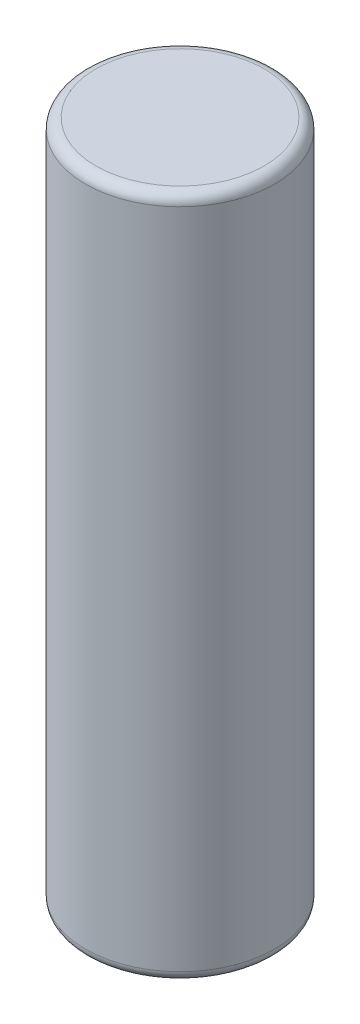
ISO-10303-21;
HEADER;
FILE_DESCRIPTION(('STEP AP214'),'2;1');
FILE_NAME('part.step','',(''),(''),'','','');
FILE_SCHEMA(('AUTOMOTIVE_DESIGN { 1 0 10303 214 1 1 1 1 }'));
ENDSEC;
DATA;
#1=APPLICATION_CONTEXT('core data for automotive mechanical design processes');
#2=APPLICATION_PROTOCOL_DEFINITION('international standard','automotive_design',2000,#1);
#3=PRODUCT_CONTEXT('',#1,'mechanical');
#4=PRODUCT('Part','Part','',(#3));
#5=PRODUCT_RELATED_PRODUCT_CATEGORY('part','',(#4));
#6=PRODUCT_DEFINITION_FORMATION('','',#4);
#7=PRODUCT_DEFINITION_CONTEXT('part definition',#1,'design');
#8=PRODUCT_DEFINITION('design','',#6,#7);
#9=PRODUCT_DEFINITION_SHAPE('','',#8);
#10=(LENGTH_UNIT() NAMED_UNIT(*) SI_UNIT(.MILLI.,.METRE.));
#11=(NAMED_UNIT(*) PLANE_ANGLE_UNIT() SI_UNIT($,.RADIAN.));
#12=(NAMED_UNIT(*) SI_UNIT($,.STERADIAN.) SOLID_ANGLE_UNIT());
#13=UNCERTAINTY_MEASURE_WITH_UNIT(LENGTH_MEASURE(1.E-05),#10,'distance_accuracy_value','');
#14=(GEOMETRIC_REPRESENTATION_CONTEXT(3) GLOBAL_UNCERTAINTY_ASSIGNED_CONTEXT((#13)) GLOBAL_UNIT_ASSIGNED_CONTEXT((#10,
#11,#12)) REPRESENTATION_CONTEXT('',''));
#15=CARTESIAN_POINT('',(0.,0.,0.));
#16=DIRECTION('',(0.,0.,1.));
#17=DIRECTION('',(1.,0.,0.));
#18=AXIS2_PLACEMENT_3D('',#15,#16,#17);
#19=CARTESIAN_POINT('',(0.,65.,0.));
#20=DIRECTION('',(0.,-1.,0.));
#21=DIRECTION('',(0.,0.,-1.));
#22=AXIS2_PLACEMENT_3D('',#19,#20,#21);
#23=CYLINDRICAL_SURFACE('',#22,9.);
#24=CARTESIAN_POINT('',(0.,1.,0.));
#25=DIRECTION('',(0.,1.,0.));
#26=DIRECTION('',(0.,0.,1.));
#27=AXIS2_PLACEMENT_3D('',#24,#25,#26);
#28=CIRCLE('',#27,9.);
#29=CARTESIAN_POINT('',(0.,1.,9.));
#30=VERTEX_POINT('',#29);
#31=EDGE_CURVE('E43',#30,#30,#28,.T.);
#32=ORIENTED_EDGE('',*,*,#31,.T.);
#33=EDGE_LOOP('',(#32));
#34=FACE_BOUND('',#33,.T.);
#35=CARTESIAN_POINT('',(0.,64.,0.));
#36=DIRECTION('',(0.,1.,0.));
#37=DIRECTION('',(0.,0.,1.));
#38=AXIS2_PLACEMENT_3D('',#35,#36,#37);
#39=CIRCLE('',#38,9.);
#40=CARTESIAN_POINT('',(0.,64.,9.));
#41=VERTEX_POINT('',#40);
#42=EDGE_CURVE('E47',#41,#41,#39,.F.);
#43=ORIENTED_EDGE('',*,*,#42,.T.);
#44=EDGE_LOOP('',(#43));
#45=FACE_BOUND('',#44,.T.);
#46=ADVANCED_FACE('F32',(#34,#45),#23,.T.);
#47=CARTESIAN_POINT('',(0.,65.,0.));
#48=DIRECTION('',(0.,1.,0.));
#49=DIRECTION('',(0.,0.,1.));
#50=AXIS2_PLACEMENT_3D('',#47,#48,#49);
#51=PLANE('',#50);
#52=CARTESIAN_POINT('',(0.,65.,0.));
#53=DIRECTION('',(0.,1.,0.));
#54=DIRECTION('',(0.,0.,1.));
#55=AXIS2_PLACEMENT_3D('',#52,#53,#54);
#56=CIRCLE('',#55,8.);
#57=CARTESIAN_POINT('',(0.,65.,8.));
#58=VERTEX_POINT('',#57);
#59=EDGE_CURVE('E10',#58,#58,#56,.T.);
#60=ORIENTED_EDGE('',*,*,#59,.T.);
#61=EDGE_LOOP('',(#60));
#62=FACE_BOUND('',#61,.T.);
#63=ADVANCED_FACE('F63',(#62),#51,.T.);
#64=CARTESIAN_POINT('',(0.,0.,0.));
#65=DIRECTION('',(0.,1.,0.));
#66=DIRECTION('',(0.,0.,1.));
#67=AXIS2_PLACEMENT_3D('',#64,#65,#66);
#68=PLANE('',#67);
#69=CARTESIAN_POINT('',(0.,0.,0.));
#70=DIRECTION('',(0.,1.,0.));
#71=DIRECTION('',(0.,0.,1.));
#72=AXIS2_PLACEMENT_3D('',#69,#70,#71);
#73=CIRCLE('',#72,8.);
#74=CARTESIAN_POINT('',(0.,0.,8.));
#75=VERTEX_POINT('',#74);
#76=EDGE_CURVE('E39',#75,#75,#73,.F.);
#77=ORIENTED_EDGE('',*,*,#76,.T.);
#78=EDGE_LOOP('',(#77));
#79=FACE_BOUND('',#78,.T.);
#80=ADVANCED_FACE('F60',(#79),#68,.F.);
#81=CARTESIAN_POINT('',(0.,1.,0.));
#82=DIRECTION('',(0.,1.,0.));
#83=DIRECTION('',(0.,0.,1.));
#84=AXIS2_PLACEMENT_3D('',#81,#82,#83);
#85=TOROIDAL_SURFACE('',#84,8.,1.);
#86=ORIENTED_EDGE('',*,*,#76,.F.);
#87=EDGE_LOOP('',(#86));
#88=FACE_BOUND('',#87,.T.);
#89=ORIENTED_EDGE('',*,*,#31,.F.);
#90=EDGE_LOOP('',(#89));
#91=FACE_BOUND('',#90,.T.);
#92=ADVANCED_FACE('F56',(#88,#91),#85,.T.);
#93=CARTESIAN_POINT('',(0.,64.,0.));
#94=DIRECTION('',(0.,1.,0.));
#95=DIRECTION('',(0.,0.,1.));
#96=AXIS2_PLACEMENT_3D('',#93,#94,#95);
#97=TOROIDAL_SURFACE('',#96,8.,1.);
#98=ORIENTED_EDGE('',*,*,#42,.F.);
#99=EDGE_LOOP('',(#98));
#100=FACE_BOUND('',#99,.T.);
#101=ORIENTED_EDGE('',*,*,#59,.F.);
#102=EDGE_LOOP('',(#101));
#103=FACE_BOUND('',#102,.T.);
#104=ADVANCED_FACE('F34',(#100,#103),#97,.T.);
#105=CLOSED_SHELL('',(#46,#63,#80,#92,#104));
#106=MANIFOLD_SOLID_BREP('B2',#105);
#107=ADVANCED_BREP_SHAPE_REPRESENTATION('',(#18,#106),#14);
#108=SHAPE_DEFINITION_REPRESENTATION(#9,#107);
ENDSEC;
END-ISO-10303-21;
